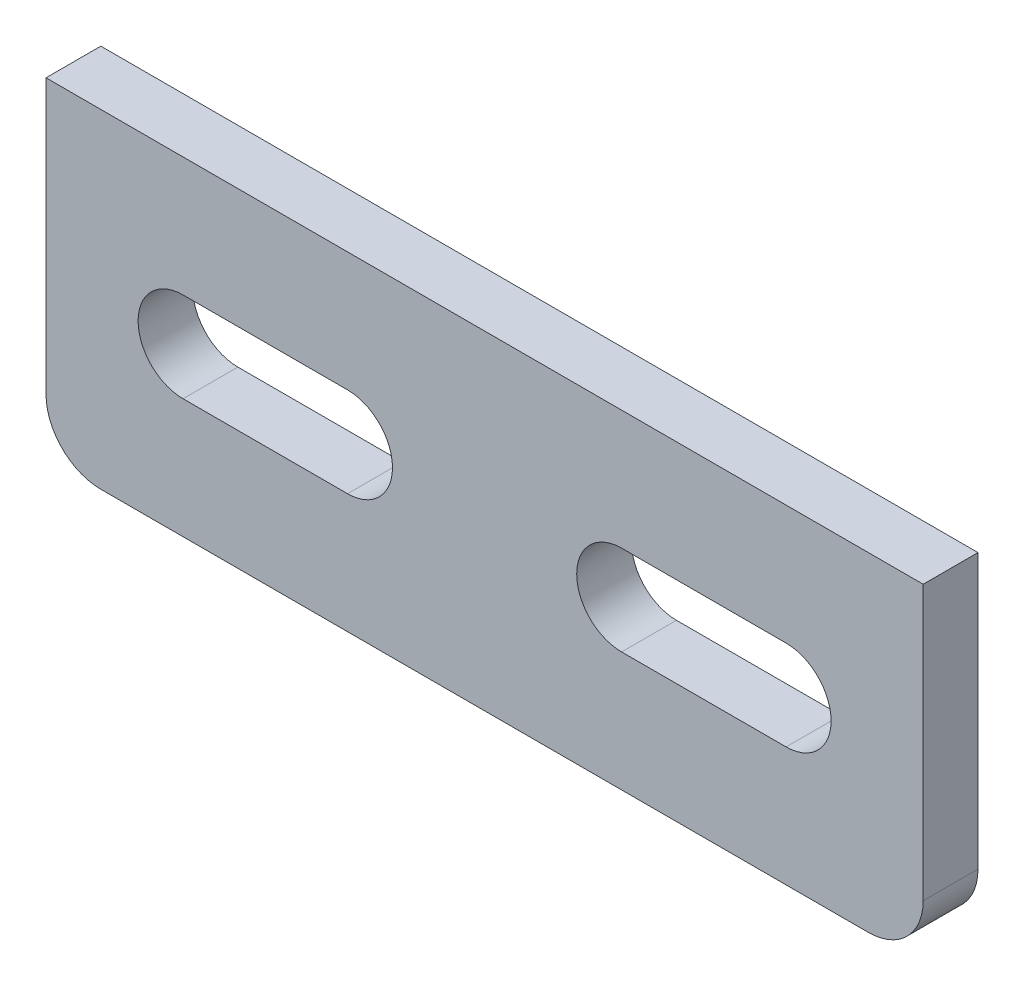
ISO-10303-21;
HEADER;
FILE_DESCRIPTION(('STEP AP214'),'2;1');
FILE_NAME('part.step','',(''),(''),'','','');
FILE_SCHEMA(('AUTOMOTIVE_DESIGN { 1 0 10303 214 1 1 1 1 }'));
ENDSEC;
DATA;
#1=APPLICATION_CONTEXT('core data for automotive mechanical design processes');
#2=APPLICATION_PROTOCOL_DEFINITION('international standard','automotive_design',2000,#1);
#3=PRODUCT_CONTEXT('',#1,'mechanical');
#4=PRODUCT('Part','Part','',(#3));
#5=PRODUCT_RELATED_PRODUCT_CATEGORY('part','',(#4));
#6=PRODUCT_DEFINITION_FORMATION('','',#4);
#7=PRODUCT_DEFINITION_CONTEXT('part definition',#1,'design');
#8=PRODUCT_DEFINITION('design','',#6,#7);
#9=PRODUCT_DEFINITION_SHAPE('','',#8);
#10=(LENGTH_UNIT() NAMED_UNIT(*) SI_UNIT(.MILLI.,.METRE.));
#11=(NAMED_UNIT(*) PLANE_ANGLE_UNIT() SI_UNIT($,.RADIAN.));
#12=(NAMED_UNIT(*) SI_UNIT($,.STERADIAN.) SOLID_ANGLE_UNIT());
#13=UNCERTAINTY_MEASURE_WITH_UNIT(LENGTH_MEASURE(1.E-05),#10,'distance_accuracy_value','');
#14=(GEOMETRIC_REPRESENTATION_CONTEXT(3) GLOBAL_UNCERTAINTY_ASSIGNED_CONTEXT((#13)) GLOBAL_UNIT_ASSIGNED_CONTEXT((#10,
#11,#12)) REPRESENTATION_CONTEXT('',''));
#15=CARTESIAN_POINT('',(0.,0.,0.));
#16=DIRECTION('',(0.,0.,1.));
#17=DIRECTION('',(1.,0.,0.));
#18=AXIS2_PLACEMENT_3D('',#15,#16,#17);
#19=CARTESIAN_POINT('',(40.,15.,5.));
#20=DIRECTION('',(-1.,0.,0.));
#21=DIRECTION('',(0.,-1.,0.));
#22=AXIS2_PLACEMENT_3D('',#19,#20,#21);
#23=PLANE('',#22);
#24=DIRECTION('',(0.,1.,0.));
#25=VECTOR('',#24,1.);
#26=CARTESIAN_POINT('',(40.,15.,5.));
#27=LINE('',#26,#25);
#28=CARTESIAN_POINT('',(40.,-10.,5.));
#29=VERTEX_POINT('',#28);
#30=CARTESIAN_POINT('',(40.,15.,5.));
#31=VERTEX_POINT('',#30);
#32=EDGE_CURVE('E192',#29,#31,#27,.T.);
#33=ORIENTED_EDGE('',*,*,#32,.F.);
#34=DIRECTION('',(0.,0.,-1.));
#35=VECTOR('',#34,1.);
#36=CARTESIAN_POINT('',(40.,-10.,5.));
#37=LINE('',#36,#35);
#38=CARTESIAN_POINT('',(40.,-10.,0.));
#39=VERTEX_POINT('',#38);
#40=EDGE_CURVE('E217',#29,#39,#37,.T.);
#41=ORIENTED_EDGE('',*,*,#40,.T.);
#42=DIRECTION('',(0.,1.,0.));
#43=VECTOR('',#42,1.);
#44=CARTESIAN_POINT('',(40.,15.,0.));
#45=LINE('',#44,#43);
#46=CARTESIAN_POINT('',(40.,15.,0.));
#47=VERTEX_POINT('',#46);
#48=EDGE_CURVE('E171',#39,#47,#45,.T.);
#49=ORIENTED_EDGE('',*,*,#48,.T.);
#50=DIRECTION('',(0.,0.,-1.));
#51=VECTOR('',#50,1.);
#52=CARTESIAN_POINT('',(40.,15.,5.));
#53=LINE('',#52,#51);
#54=EDGE_CURVE('E214',#31,#47,#53,.T.);
#55=ORIENTED_EDGE('',*,*,#54,.F.);
#56=EDGE_LOOP('',(#33,#41,#49,#55));
#57=FACE_BOUND('',#56,.T.);
#58=ADVANCED_FACE('F39',(#57),#23,.F.);
#59=CARTESIAN_POINT('',(-40.,15.,5.));
#60=DIRECTION('',(0.,-1.,0.));
#61=DIRECTION('',(0.,0.,-1.));
#62=AXIS2_PLACEMENT_3D('',#59,#60,#61);
#63=PLANE('',#62);
#64=DIRECTION('',(-1.,0.,0.));
#65=VECTOR('',#64,1.);
#66=CARTESIAN_POINT('',(-40.,15.,0.));
#67=LINE('',#66,#65);
#68=CARTESIAN_POINT('',(-40.,15.,0.));
#69=VERTEX_POINT('',#68);
#70=EDGE_CURVE('E205',#47,#69,#67,.T.);
#71=ORIENTED_EDGE('',*,*,#70,.T.);
#72=DIRECTION('',(0.,0.,-1.));
#73=VECTOR('',#72,1.);
#74=CARTESIAN_POINT('',(-40.,15.,5.));
#75=LINE('',#74,#73);
#76=CARTESIAN_POINT('',(-40.,15.,5.));
#77=VERTEX_POINT('',#76);
#78=EDGE_CURVE('E203',#77,#69,#75,.T.);
#79=ORIENTED_EDGE('',*,*,#78,.F.);
#80=DIRECTION('',(-1.,0.,0.));
#81=VECTOR('',#80,1.);
#82=CARTESIAN_POINT('',(-40.,15.,5.));
#83=LINE('',#82,#81);
#84=EDGE_CURVE('E194',#31,#77,#83,.T.);
#85=ORIENTED_EDGE('',*,*,#84,.F.);
#86=ORIENTED_EDGE('',*,*,#54,.T.);
#87=EDGE_LOOP('',(#71,#79,#85,#86));
#88=FACE_BOUND('',#87,.T.);
#89=ADVANCED_FACE('F271',(#88),#63,.F.);
#90=CARTESIAN_POINT('',(-40.,15.,5.));
#91=DIRECTION('',(1.,0.,0.));
#92=DIRECTION('',(0.,0.,-1.));
#93=AXIS2_PLACEMENT_3D('',#90,#91,#92);
#94=PLANE('',#93);
#95=DIRECTION('',(0.,-1.,0.));
#96=VECTOR('',#95,1.);
#97=CARTESIAN_POINT('',(-40.,15.,0.));
#98=LINE('',#97,#96);
#99=CARTESIAN_POINT('',(-40.,-10.,0.));
#100=VERTEX_POINT('',#99);
#101=EDGE_CURVE('E207',#69,#100,#98,.T.);
#102=ORIENTED_EDGE('',*,*,#101,.T.);
#103=DIRECTION('',(0.,0.,-1.));
#104=VECTOR('',#103,1.);
#105=CARTESIAN_POINT('',(-40.,-10.,5.));
#106=LINE('',#105,#104);
#107=CARTESIAN_POINT('',(-40.,-10.,5.));
#108=VERTEX_POINT('',#107);
#109=EDGE_CURVE('E233',#100,#108,#106,.F.);
#110=ORIENTED_EDGE('',*,*,#109,.T.);
#111=DIRECTION('',(0.,-1.,0.));
#112=VECTOR('',#111,1.);
#113=CARTESIAN_POINT('',(-40.,15.,5.));
#114=LINE('',#113,#112);
#115=EDGE_CURVE('E197',#77,#108,#114,.T.);
#116=ORIENTED_EDGE('',*,*,#115,.F.);
#117=ORIENTED_EDGE('',*,*,#78,.T.);
#118=EDGE_LOOP('',(#102,#110,#116,#117));
#119=FACE_BOUND('',#118,.T.);
#120=ADVANCED_FACE('F277',(#119),#94,.F.);
#121=CARTESIAN_POINT('',(-40.,-15.,5.));
#122=DIRECTION('',(0.,1.,0.));
#123=DIRECTION('',(0.,0.,1.));
#124=AXIS2_PLACEMENT_3D('',#121,#122,#123);
#125=PLANE('',#124);
#126=DIRECTION('',(1.,0.,0.));
#127=VECTOR('',#126,1.);
#128=CARTESIAN_POINT('',(-40.,-15.,0.));
#129=LINE('',#128,#127);
#130=CARTESIAN_POINT('',(-35.,-15.,0.));
#131=VERTEX_POINT('',#130);
#132=CARTESIAN_POINT('',(35.,-15.,0.));
#133=VERTEX_POINT('',#132);
#134=EDGE_CURVE('E195',#131,#133,#129,.T.);
#135=ORIENTED_EDGE('',*,*,#134,.T.);
#136=DIRECTION('',(0.,0.,-1.));
#137=VECTOR('',#136,1.);
#138=CARTESIAN_POINT('',(35.,-15.,5.));
#139=LINE('',#138,#137);
#140=CARTESIAN_POINT('',(35.,-15.,5.));
#141=VERTEX_POINT('',#140);
#142=EDGE_CURVE('E227',#133,#141,#139,.F.);
#143=ORIENTED_EDGE('',*,*,#142,.T.);
#144=DIRECTION('',(1.,0.,0.));
#145=VECTOR('',#144,1.);
#146=CARTESIAN_POINT('',(-40.,-15.,5.));
#147=LINE('',#146,#145);
#148=CARTESIAN_POINT('',(-35.,-15.,5.));
#149=VERTEX_POINT('',#148);
#150=EDGE_CURVE('E200',#149,#141,#147,.T.);
#151=ORIENTED_EDGE('',*,*,#150,.F.);
#152=DIRECTION('',(0.,0.,-1.));
#153=VECTOR('',#152,1.);
#154=CARTESIAN_POINT('',(-35.,-15.,5.));
#155=LINE('',#154,#153);
#156=EDGE_CURVE('E224',#149,#131,#155,.T.);
#157=ORIENTED_EDGE('',*,*,#156,.T.);
#158=EDGE_LOOP('',(#135,#143,#151,#157));
#159=FACE_BOUND('',#158,.T.);
#160=ADVANCED_FACE('F309',(#159),#125,.F.);
#161=CARTESIAN_POINT('',(0.,0.,5.));
#162=DIRECTION('',(0.,0.,1.));
#163=DIRECTION('',(1.,0.,0.));
#164=AXIS2_PLACEMENT_3D('',#161,#162,#163);
#165=PLANE('',#164);
#166=CARTESIAN_POINT('',(-27.5,0.,5.));
#167=DIRECTION('',(0.,0.,1.));
#168=DIRECTION('',(1.,0.,0.));
#169=AXIS2_PLACEMENT_3D('',#166,#167,#168);
#170=CIRCLE('',#169,4.1);
#171=CARTESIAN_POINT('',(-27.5,4.1,5.));
#172=VERTEX_POINT('',#171);
#173=CARTESIAN_POINT('',(-27.5,-4.1,5.));
#174=VERTEX_POINT('',#173);
#175=EDGE_CURVE('E54',#172,#174,#170,.T.);
#176=ORIENTED_EDGE('',*,*,#175,.F.);
#177=DIRECTION('',(-1.,0.,0.));
#178=VECTOR('',#177,1.);
#179=CARTESIAN_POINT('',(-27.5,4.1,5.));
#180=LINE('',#179,#178);
#181=CARTESIAN_POINT('',(-12.5,4.1,5.));
#182=VERTEX_POINT('',#181);
#183=EDGE_CURVE('E164',#182,#172,#180,.T.);
#184=ORIENTED_EDGE('',*,*,#183,.F.);
#185=CARTESIAN_POINT('',(-12.5,0.,5.));
#186=DIRECTION('',(0.,0.,1.));
#187=DIRECTION('',(1.,0.,0.));
#188=AXIS2_PLACEMENT_3D('',#185,#186,#187);
#189=CIRCLE('',#188,4.1);
#190=CARTESIAN_POINT('',(-12.5,-4.1,5.));
#191=VERTEX_POINT('',#190);
#192=EDGE_CURVE('E147',#191,#182,#189,.T.);
#193=ORIENTED_EDGE('',*,*,#192,.F.);
#194=DIRECTION('',(1.,0.,0.));
#195=VECTOR('',#194,1.);
#196=CARTESIAN_POINT('',(-27.5,-4.1,5.));
#197=LINE('',#196,#195);
#198=EDGE_CURVE('E157',#174,#191,#197,.T.);
#199=ORIENTED_EDGE('',*,*,#198,.F.);
#200=EDGE_LOOP('',(#176,#184,#193,#199));
#201=FACE_BOUND('',#200,.T.);
#202=CARTESIAN_POINT('',(12.5,0.,5.));
#203=DIRECTION('',(0.,0.,1.));
#204=DIRECTION('',(1.,0.,0.));
#205=AXIS2_PLACEMENT_3D('',#202,#203,#204);
#206=CIRCLE('',#205,4.1);
#207=CARTESIAN_POINT('',(12.5,4.1,5.));
#208=VERTEX_POINT('',#207);
#209=CARTESIAN_POINT('',(12.5,-4.1,5.));
#210=VERTEX_POINT('',#209);
#211=EDGE_CURVE('E62',#208,#210,#206,.T.);
#212=ORIENTED_EDGE('',*,*,#211,.F.);
#213=DIRECTION('',(-1.,0.,0.));
#214=VECTOR('',#213,1.);
#215=CARTESIAN_POINT('',(12.5,4.1,5.));
#216=LINE('',#215,#214);
#217=CARTESIAN_POINT('',(27.5,4.1,5.));
#218=VERTEX_POINT('',#217);
#219=EDGE_CURVE('E176',#218,#208,#216,.T.);
#220=ORIENTED_EDGE('',*,*,#219,.F.);
#221=CARTESIAN_POINT('',(27.5,0.,5.));
#222=DIRECTION('',(0.,0.,1.));
#223=DIRECTION('',(1.,0.,0.));
#224=AXIS2_PLACEMENT_3D('',#221,#222,#223);
#225=CIRCLE('',#224,4.1);
#226=CARTESIAN_POINT('',(27.5,-4.1,5.));
#227=VERTEX_POINT('',#226);
#228=EDGE_CURVE('E185',#227,#218,#225,.T.);
#229=ORIENTED_EDGE('',*,*,#228,.F.);
#230=DIRECTION('',(1.,0.,0.));
#231=VECTOR('',#230,1.);
#232=CARTESIAN_POINT('',(12.5,-4.1,5.));
#233=LINE('',#232,#231);
#234=EDGE_CURVE('E188',#210,#227,#233,.T.);
#235=ORIENTED_EDGE('',*,*,#234,.F.);
#236=EDGE_LOOP('',(#212,#220,#229,#235));
#237=FACE_BOUND('',#236,.T.);
#238=ORIENTED_EDGE('',*,*,#150,.T.);
#239=CARTESIAN_POINT('',(35.,-10.,5.));
#240=DIRECTION('',(0.,0.,1.));
#241=DIRECTION('',(1.,0.,0.));
#242=AXIS2_PLACEMENT_3D('',#239,#240,#241);
#243=CIRCLE('',#242,5.);
#244=EDGE_CURVE('E231',#141,#29,#243,.T.);
#245=ORIENTED_EDGE('',*,*,#244,.T.);
#246=ORIENTED_EDGE('',*,*,#32,.T.);
#247=ORIENTED_EDGE('',*,*,#84,.T.);
#248=ORIENTED_EDGE('',*,*,#115,.T.);
#249=CARTESIAN_POINT('',(-35.,-10.,5.));
#250=DIRECTION('',(0.,0.,1.));
#251=DIRECTION('',(1.,0.,0.));
#252=AXIS2_PLACEMENT_3D('',#249,#250,#251);
#253=CIRCLE('',#252,5.);
#254=EDGE_CURVE('E229',#108,#149,#253,.T.);
#255=ORIENTED_EDGE('',*,*,#254,.T.);
#256=EDGE_LOOP('',(#238,#245,#246,#247,#248,#255));
#257=FACE_BOUND('',#256,.T.);
#258=ADVANCED_FACE('F161',(#201,#237,#257),#165,.T.);
#259=CARTESIAN_POINT('',(0.,0.,0.));
#260=DIRECTION('',(0.,0.,1.));
#261=DIRECTION('',(1.,0.,0.));
#262=AXIS2_PLACEMENT_3D('',#259,#260,#261);
#263=PLANE('',#262);
#264=DIRECTION('',(-1.,0.,0.));
#265=VECTOR('',#264,1.);
#266=CARTESIAN_POINT('',(0.,4.1,0.));
#267=LINE('',#266,#265);
#268=CARTESIAN_POINT('',(-12.5,4.1,0.));
#269=VERTEX_POINT('',#268);
#270=CARTESIAN_POINT('',(-27.5,4.1,0.));
#271=VERTEX_POINT('',#270);
#272=EDGE_CURVE('E47',#269,#271,#267,.T.);
#273=ORIENTED_EDGE('',*,*,#272,.T.);
#274=CARTESIAN_POINT('',(-27.5,0.,0.));
#275=DIRECTION('',(0.,0.,1.));
#276=DIRECTION('',(1.,0.,0.));
#277=AXIS2_PLACEMENT_3D('',#274,#275,#276);
#278=CIRCLE('',#277,4.1);
#279=CARTESIAN_POINT('',(-27.5,-4.1,0.));
#280=VERTEX_POINT('',#279);
#281=EDGE_CURVE('E11',#271,#280,#278,.T.);
#282=ORIENTED_EDGE('',*,*,#281,.T.);
#283=DIRECTION('',(1.,0.,0.));
#284=VECTOR('',#283,1.);
#285=CARTESIAN_POINT('',(0.,-4.09999999999999,0.));
#286=LINE('',#285,#284);
#287=CARTESIAN_POINT('',(-12.5,-4.09999999999999,0.));
#288=VERTEX_POINT('',#287);
#289=EDGE_CURVE('E247',#280,#288,#286,.T.);
#290=ORIENTED_EDGE('',*,*,#289,.T.);
#291=CARTESIAN_POINT('',(-12.5,0.,0.));
#292=DIRECTION('',(0.,0.,1.));
#293=DIRECTION('',(1.,0.,0.));
#294=AXIS2_PLACEMENT_3D('',#291,#292,#293);
#295=CIRCLE('',#294,4.1);
#296=EDGE_CURVE('E150',#288,#269,#295,.T.);
#297=ORIENTED_EDGE('',*,*,#296,.T.);
#298=EDGE_LOOP('',(#273,#282,#290,#297));
#299=FACE_BOUND('',#298,.T.);
#300=DIRECTION('',(-1.,0.,0.));
#301=VECTOR('',#300,1.);
#302=CARTESIAN_POINT('',(0.,4.1,0.));
#303=LINE('',#302,#301);
#304=CARTESIAN_POINT('',(27.5,4.1,0.));
#305=VERTEX_POINT('',#304);
#306=CARTESIAN_POINT('',(12.5,4.1,0.));
#307=VERTEX_POINT('',#306);
#308=EDGE_CURVE('E241',#305,#307,#303,.T.);
#309=ORIENTED_EDGE('',*,*,#308,.T.);
#310=CARTESIAN_POINT('',(12.5,0.,0.));
#311=DIRECTION('',(0.,0.,1.));
#312=DIRECTION('',(1.,0.,0.));
#313=AXIS2_PLACEMENT_3D('',#310,#311,#312);
#314=CIRCLE('',#313,4.1);
#315=CARTESIAN_POINT('',(12.5,-4.1,0.));
#316=VERTEX_POINT('',#315);
#317=EDGE_CURVE('E244',#307,#316,#314,.T.);
#318=ORIENTED_EDGE('',*,*,#317,.T.);
#319=DIRECTION('',(1.,0.,0.));
#320=VECTOR('',#319,1.);
#321=CARTESIAN_POINT('',(0.,-4.1,0.));
#322=LINE('',#321,#320);
#323=CARTESIAN_POINT('',(27.5,-4.1,0.));
#324=VERTEX_POINT('',#323);
#325=EDGE_CURVE('E235',#316,#324,#322,.T.);
#326=ORIENTED_EDGE('',*,*,#325,.T.);
#327=CARTESIAN_POINT('',(27.5,0.,0.));
#328=DIRECTION('',(0.,0.,1.));
#329=DIRECTION('',(1.,0.,0.));
#330=AXIS2_PLACEMENT_3D('',#327,#328,#329);
#331=CIRCLE('',#330,4.1);
#332=EDGE_CURVE('E238',#324,#305,#331,.T.);
#333=ORIENTED_EDGE('',*,*,#332,.T.);
#334=EDGE_LOOP('',(#309,#318,#326,#333));
#335=FACE_BOUND('',#334,.T.);
#336=ORIENTED_EDGE('',*,*,#48,.F.);
#337=CARTESIAN_POINT('',(35.,-10.,0.));
#338=DIRECTION('',(0.,0.,1.));
#339=DIRECTION('',(1.,0.,0.));
#340=AXIS2_PLACEMENT_3D('',#337,#338,#339);
#341=CIRCLE('',#340,5.);
#342=EDGE_CURVE('E222',#39,#133,#341,.F.);
#343=ORIENTED_EDGE('',*,*,#342,.T.);
#344=ORIENTED_EDGE('',*,*,#134,.F.);
#345=CARTESIAN_POINT('',(-35.,-10.,0.));
#346=DIRECTION('',(0.,0.,1.));
#347=DIRECTION('',(1.,0.,0.));
#348=AXIS2_PLACEMENT_3D('',#345,#346,#347);
#349=CIRCLE('',#348,5.);
#350=EDGE_CURVE('E220',#131,#100,#349,.F.);
#351=ORIENTED_EDGE('',*,*,#350,.T.);
#352=ORIENTED_EDGE('',*,*,#101,.F.);
#353=ORIENTED_EDGE('',*,*,#70,.F.);
#354=EDGE_LOOP('',(#336,#343,#344,#351,#352,#353));
#355=FACE_BOUND('',#354,.T.);
#356=ADVANCED_FACE('F251',(#299,#335,#355),#263,.F.);
#357=CARTESIAN_POINT('',(35.,-10.,5.));
#358=DIRECTION('',(0.,0.,-1.));
#359=DIRECTION('',(-1.,0.,0.));
#360=AXIS2_PLACEMENT_3D('',#357,#358,#359);
#361=CYLINDRICAL_SURFACE('',#360,5.);
#362=ORIENTED_EDGE('',*,*,#244,.F.);
#363=ORIENTED_EDGE('',*,*,#142,.F.);
#364=ORIENTED_EDGE('',*,*,#342,.F.);
#365=ORIENTED_EDGE('',*,*,#40,.F.);
#366=EDGE_LOOP('',(#362,#363,#364,#365));
#367=FACE_BOUND('',#366,.T.);
#368=ADVANCED_FACE('F282',(#367),#361,.T.);
#369=CARTESIAN_POINT('',(-35.,-10.,5.));
#370=DIRECTION('',(0.,0.,-1.));
#371=DIRECTION('',(-1.,0.,0.));
#372=AXIS2_PLACEMENT_3D('',#369,#370,#371);
#373=CYLINDRICAL_SURFACE('',#372,5.);
#374=ORIENTED_EDGE('',*,*,#254,.F.);
#375=ORIENTED_EDGE('',*,*,#109,.F.);
#376=ORIENTED_EDGE('',*,*,#350,.F.);
#377=ORIENTED_EDGE('',*,*,#156,.F.);
#378=EDGE_LOOP('',(#374,#375,#376,#377));
#379=FACE_BOUND('',#378,.T.);
#380=ADVANCED_FACE('F41',(#379),#373,.T.);
#381=CARTESIAN_POINT('',(12.5,0.,-3.));
#382=DIRECTION('',(0.,0.,1.));
#383=DIRECTION('',(1.,0.,0.));
#384=AXIS2_PLACEMENT_3D('',#381,#382,#383);
#385=CYLINDRICAL_SURFACE('',#384,4.1);
#386=DIRECTION('',(0.,0.,1.));
#387=VECTOR('',#386,1.);
#388=CARTESIAN_POINT('',(12.5,4.1,-3.));
#389=LINE('',#388,#387);
#390=EDGE_CURVE('E181',#307,#208,#389,.T.);
#391=ORIENTED_EDGE('',*,*,#390,.T.);
#392=ORIENTED_EDGE('',*,*,#211,.T.);
#393=DIRECTION('',(0.,0.,1.));
#394=VECTOR('',#393,1.);
#395=CARTESIAN_POINT('',(12.5,-4.1,-3.));
#396=LINE('',#395,#394);
#397=EDGE_CURVE('E174',#316,#210,#396,.T.);
#398=ORIENTED_EDGE('',*,*,#397,.F.);
#399=ORIENTED_EDGE('',*,*,#317,.F.);
#400=EDGE_LOOP('',(#391,#392,#398,#399));
#401=FACE_BOUND('',#400,.T.);
#402=ADVANCED_FACE('F289',(#401),#385,.F.);
#403=CARTESIAN_POINT('',(12.5,4.1,-3.));
#404=DIRECTION('',(0.,1.,0.));
#405=DIRECTION('',(-1.,0.,0.));
#406=AXIS2_PLACEMENT_3D('',#403,#404,#405);
#407=PLANE('',#406);
#408=DIRECTION('',(0.,0.,1.));
#409=VECTOR('',#408,1.);
#410=CARTESIAN_POINT('',(27.5,4.1,-3.));
#411=LINE('',#410,#409);
#412=EDGE_CURVE('E179',#305,#218,#411,.T.);
#413=ORIENTED_EDGE('',*,*,#412,.T.);
#414=ORIENTED_EDGE('',*,*,#219,.T.);
#415=ORIENTED_EDGE('',*,*,#390,.F.);
#416=ORIENTED_EDGE('',*,*,#308,.F.);
#417=EDGE_LOOP('',(#413,#414,#415,#416));
#418=FACE_BOUND('',#417,.T.);
#419=ADVANCED_FACE('F320',(#418),#407,.F.);
#420=CARTESIAN_POINT('',(27.5,0.,-3.));
#421=DIRECTION('',(0.,0.,1.));
#422=DIRECTION('',(1.,0.,0.));
#423=AXIS2_PLACEMENT_3D('',#420,#421,#422);
#424=CYLINDRICAL_SURFACE('',#423,4.1);
#425=DIRECTION('',(0.,0.,1.));
#426=VECTOR('',#425,1.);
#427=CARTESIAN_POINT('',(27.5,-4.1,-3.));
#428=LINE('',#427,#426);
#429=EDGE_CURVE('E177',#324,#227,#428,.T.);
#430=ORIENTED_EDGE('',*,*,#429,.T.);
#431=ORIENTED_EDGE('',*,*,#228,.T.);
#432=ORIENTED_EDGE('',*,*,#412,.F.);
#433=ORIENTED_EDGE('',*,*,#332,.F.);
#434=EDGE_LOOP('',(#430,#431,#432,#433));
#435=FACE_BOUND('',#434,.T.);
#436=ADVANCED_FACE('F265',(#435),#424,.F.);
#437=CARTESIAN_POINT('',(12.5,-4.1,-3.));
#438=DIRECTION('',(0.,-1.,0.));
#439=DIRECTION('',(1.,0.,0.));
#440=AXIS2_PLACEMENT_3D('',#437,#438,#439);
#441=PLANE('',#440);
#442=ORIENTED_EDGE('',*,*,#397,.T.);
#443=ORIENTED_EDGE('',*,*,#234,.T.);
#444=ORIENTED_EDGE('',*,*,#429,.F.);
#445=ORIENTED_EDGE('',*,*,#325,.F.);
#446=EDGE_LOOP('',(#442,#443,#444,#445));
#447=FACE_BOUND('',#446,.T.);
#448=ADVANCED_FACE('F258',(#447),#441,.F.);
#449=CARTESIAN_POINT('',(-27.5,0.,-3.));
#450=DIRECTION('',(0.,0.,1.));
#451=DIRECTION('',(1.,0.,0.));
#452=AXIS2_PLACEMENT_3D('',#449,#450,#451);
#453=CYLINDRICAL_SURFACE('',#452,4.1);
#454=DIRECTION('',(0.,0.,1.));
#455=VECTOR('',#454,1.);
#456=CARTESIAN_POINT('',(-27.5,4.1,-3.));
#457=LINE('',#456,#455);
#458=EDGE_CURVE('E169',#271,#172,#457,.T.);
#459=ORIENTED_EDGE('',*,*,#458,.T.);
#460=ORIENTED_EDGE('',*,*,#175,.T.);
#461=DIRECTION('',(0.,0.,1.));
#462=VECTOR('',#461,1.);
#463=CARTESIAN_POINT('',(-27.5,-4.1,-3.));
#464=LINE('',#463,#462);
#465=EDGE_CURVE('E154',#280,#174,#464,.T.);
#466=ORIENTED_EDGE('',*,*,#465,.F.);
#467=ORIENTED_EDGE('',*,*,#281,.F.);
#468=EDGE_LOOP('',(#459,#460,#466,#467));
#469=FACE_BOUND('',#468,.T.);
#470=ADVANCED_FACE('F256',(#469),#453,.F.);
#471=CARTESIAN_POINT('',(-27.5,4.1,-3.));
#472=DIRECTION('',(0.,1.,0.));
#473=DIRECTION('',(-1.,0.,0.));
#474=AXIS2_PLACEMENT_3D('',#471,#472,#473);
#475=PLANE('',#474);
#476=DIRECTION('',(0.,0.,1.));
#477=VECTOR('',#476,1.);
#478=CARTESIAN_POINT('',(-12.5,4.1,-3.));
#479=LINE('',#478,#477);
#480=EDGE_CURVE('E153',#269,#182,#479,.T.);
#481=ORIENTED_EDGE('',*,*,#480,.T.);
#482=ORIENTED_EDGE('',*,*,#183,.T.);
#483=ORIENTED_EDGE('',*,*,#458,.F.);
#484=ORIENTED_EDGE('',*,*,#272,.F.);
#485=EDGE_LOOP('',(#481,#482,#483,#484));
#486=FACE_BOUND('',#485,.T.);
#487=ADVANCED_FACE('F255',(#486),#475,.F.);
#488=CARTESIAN_POINT('',(-12.5,0.,-3.));
#489=DIRECTION('',(0.,0.,1.));
#490=DIRECTION('',(1.,0.,0.));
#491=AXIS2_PLACEMENT_3D('',#488,#489,#490);
#492=CYLINDRICAL_SURFACE('',#491,4.1);
#493=DIRECTION('',(0.,0.,1.));
#494=VECTOR('',#493,1.);
#495=CARTESIAN_POINT('',(-12.5,-4.1,-3.));
#496=LINE('',#495,#494);
#497=EDGE_CURVE('E142',#288,#191,#496,.T.);
#498=ORIENTED_EDGE('',*,*,#497,.T.);
#499=ORIENTED_EDGE('',*,*,#192,.T.);
#500=ORIENTED_EDGE('',*,*,#480,.F.);
#501=ORIENTED_EDGE('',*,*,#296,.F.);
#502=EDGE_LOOP('',(#498,#499,#500,#501));
#503=FACE_BOUND('',#502,.T.);
#504=ADVANCED_FACE('F144',(#503),#492,.F.);
#505=CARTESIAN_POINT('',(-27.5,-4.1,-3.));
#506=DIRECTION('',(0.,-1.,0.));
#507=DIRECTION('',(1.,0.,0.));
#508=AXIS2_PLACEMENT_3D('',#505,#506,#507);
#509=PLANE('',#508);
#510=ORIENTED_EDGE('',*,*,#465,.T.);
#511=ORIENTED_EDGE('',*,*,#198,.T.);
#512=ORIENTED_EDGE('',*,*,#497,.F.);
#513=ORIENTED_EDGE('',*,*,#289,.F.);
#514=EDGE_LOOP('',(#510,#511,#512,#513));
#515=FACE_BOUND('',#514,.T.);
#516=ADVANCED_FACE('F158',(#515),#509,.F.);
#517=CLOSED_SHELL('',(#58,#89,#120,#160,#258,#356,#368,#380,#402,#419,#436,#448,#470,#487,#504,#516));
#518=MANIFOLD_SOLID_BREP('B2',#517);
#519=ADVANCED_BREP_SHAPE_REPRESENTATION('',(#18,#518),#14);
#520=SHAPE_DEFINITION_REPRESENTATION(#9,#519);
ENDSEC;
END-ISO-10303-21;
